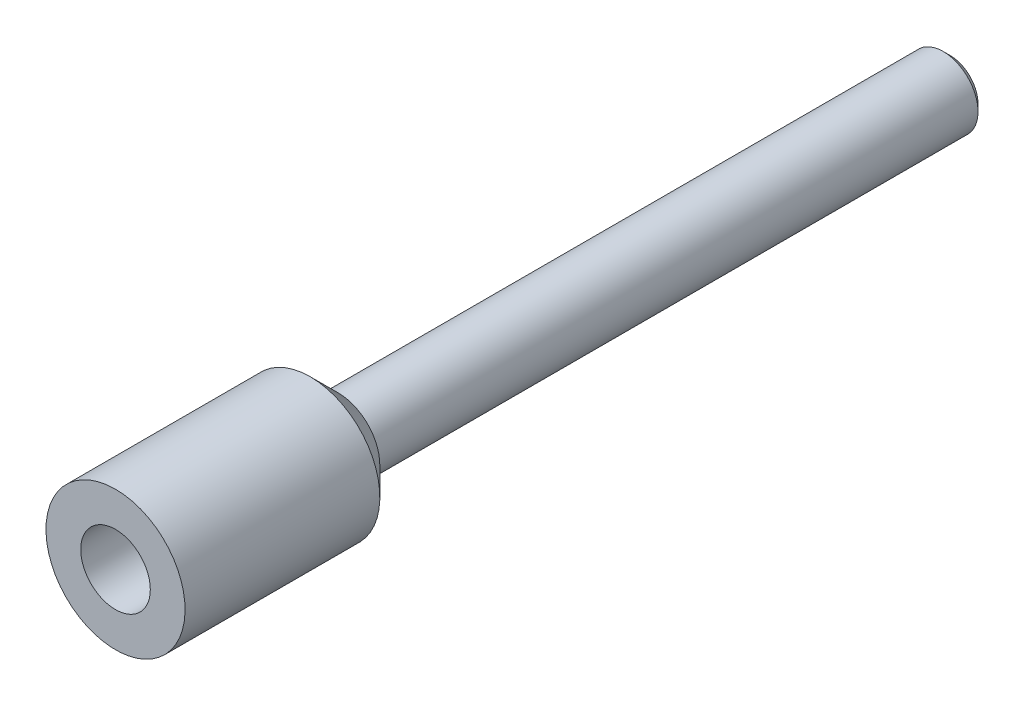
ISO-10303-21;
HEADER;
FILE_DESCRIPTION(('STEP AP214'),'2;1');
FILE_NAME('part.step','',(''),(''),'','','');
FILE_SCHEMA(('AUTOMOTIVE_DESIGN { 1 0 10303 214 1 1 1 1 }'));
ENDSEC;
DATA;
#1=APPLICATION_CONTEXT('core data for automotive mechanical design processes');
#2=APPLICATION_PROTOCOL_DEFINITION('international standard','automotive_design',2000,#1);
#3=PRODUCT_CONTEXT('',#1,'mechanical');
#4=PRODUCT('Part','Part','',(#3));
#5=PRODUCT_RELATED_PRODUCT_CATEGORY('part','',(#4));
#6=PRODUCT_DEFINITION_FORMATION('','',#4);
#7=PRODUCT_DEFINITION_CONTEXT('part definition',#1,'design');
#8=PRODUCT_DEFINITION('design','',#6,#7);
#9=PRODUCT_DEFINITION_SHAPE('','',#8);
#10=(LENGTH_UNIT() NAMED_UNIT(*) SI_UNIT(.MILLI.,.METRE.));
#11=(NAMED_UNIT(*) PLANE_ANGLE_UNIT() SI_UNIT($,.RADIAN.));
#12=(NAMED_UNIT(*) SI_UNIT($,.STERADIAN.) SOLID_ANGLE_UNIT());
#13=UNCERTAINTY_MEASURE_WITH_UNIT(LENGTH_MEASURE(1.E-05),#10,'distance_accuracy_value','');
#14=(GEOMETRIC_REPRESENTATION_CONTEXT(3) GLOBAL_UNCERTAINTY_ASSIGNED_CONTEXT((#13)) GLOBAL_UNIT_ASSIGNED_CONTEXT((#10,
#11,#12)) REPRESENTATION_CONTEXT('',''));
#15=CARTESIAN_POINT('',(0.,0.,0.));
#16=DIRECTION('',(0.,0.,1.));
#17=DIRECTION('',(1.,0.,0.));
#18=AXIS2_PLACEMENT_3D('',#15,#16,#17);
#19=CARTESIAN_POINT('',(0.,0.,0.));
#20=DIRECTION('',(0.,0.,1.));
#21=DIRECTION('',(0.,-1.,0.));
#22=AXIS2_PLACEMENT_3D('',#19,#20,#21);
#23=PLANE('',#22);
#24=CARTESIAN_POINT('',(0.,0.,0.));
#25=DIRECTION('',(0.,0.,1.));
#26=DIRECTION('',(1.,0.,0.));
#27=AXIS2_PLACEMENT_3D('',#24,#25,#26);
#28=CIRCLE('',#27,2.5);
#29=CARTESIAN_POINT('',(2.5,0.,0.));
#30=VERTEX_POINT('',#29);
#31=EDGE_CURVE('E86',#30,#30,#28,.T.);
#32=ORIENTED_EDGE('',*,*,#31,.F.);
#33=EDGE_LOOP('',(#32));
#34=FACE_BOUND('',#33,.T.);
#35=CARTESIAN_POINT('',(0.,0.,0.));
#36=DIRECTION('',(0.,0.,-1.));
#37=DIRECTION('',(0.,1.,0.));
#38=AXIS2_PLACEMENT_3D('',#35,#36,#37);
#39=CIRCLE('',#38,4.99999999999998);
#40=CARTESIAN_POINT('',(0.,4.99999999999998,0.));
#41=VERTEX_POINT('',#40);
#42=EDGE_CURVE('E99',#41,#41,#39,.T.);
#43=ORIENTED_EDGE('',*,*,#42,.F.);
#44=EDGE_LOOP('',(#43));
#45=FACE_BOUND('',#44,.T.);
#46=ADVANCED_FACE('F65',(#34,#45),#23,.T.);
#47=CARTESIAN_POINT('',(0.,0.,-60.));
#48=DIRECTION('',(0.,0.,-1.));
#49=DIRECTION('',(0.,1.,0.));
#50=AXIS2_PLACEMENT_3D('',#47,#48,#49);
#51=CYLINDRICAL_SURFACE('',#50,4.99999999999998);
#52=ORIENTED_EDGE('',*,*,#42,.T.);
#53=EDGE_LOOP('',(#52));
#54=FACE_BOUND('',#53,.T.);
#55=CARTESIAN_POINT('',(0.,0.,-14.));
#56=DIRECTION('',(0.,0.,-1.));
#57=DIRECTION('',(0.,1.,0.));
#58=AXIS2_PLACEMENT_3D('',#55,#56,#57);
#59=CIRCLE('',#58,4.99999999999998);
#60=CARTESIAN_POINT('',(0.,4.99999999999998,-14.));
#61=VERTEX_POINT('',#60);
#62=EDGE_CURVE('E96',#61,#61,#59,.T.);
#63=ORIENTED_EDGE('',*,*,#62,.F.);
#64=EDGE_LOOP('',(#63));
#65=FACE_BOUND('',#64,.T.);
#66=ADVANCED_FACE('F113',(#54,#65),#51,.T.);
#67=CARTESIAN_POINT('',(0.,0.,-16.));
#68=DIRECTION('',(0.,0.,1.));
#69=DIRECTION('',(0.,-1.,0.));
#70=AXIS2_PLACEMENT_3D('',#67,#68,#69);
#71=CONICAL_SURFACE('',#70,3.,0.785398163397443);
#72=ORIENTED_EDGE('',*,*,#62,.T.);
#73=EDGE_LOOP('',(#72));
#74=FACE_BOUND('',#73,.T.);
#75=CARTESIAN_POINT('',(0.,0.,-16.));
#76=DIRECTION('',(0.,0.,-1.));
#77=DIRECTION('',(0.,1.,0.));
#78=AXIS2_PLACEMENT_3D('',#75,#76,#77);
#79=CIRCLE('',#78,3.);
#80=CARTESIAN_POINT('',(0.,3.,-16.));
#81=VERTEX_POINT('',#80);
#82=EDGE_CURVE('E89',#81,#81,#79,.T.);
#83=ORIENTED_EDGE('',*,*,#82,.F.);
#84=EDGE_LOOP('',(#83));
#85=FACE_BOUND('',#84,.T.);
#86=ADVANCED_FACE('F118',(#74,#85),#71,.T.);
#87=CARTESIAN_POINT('',(0.,2.5,-16.));
#88=DIRECTION('',(0.,0.,-1.));
#89=DIRECTION('',(0.,1.,0.));
#90=AXIS2_PLACEMENT_3D('',#87,#88,#89);
#91=PLANE('',#90);
#92=ORIENTED_EDGE('',*,*,#82,.T.);
#93=EDGE_LOOP('',(#92));
#94=FACE_BOUND('',#93,.T.);
#95=CARTESIAN_POINT('',(0.,0.,-16.));
#96=DIRECTION('',(0.,0.,-1.));
#97=DIRECTION('',(0.,1.,0.));
#98=AXIS2_PLACEMENT_3D('',#95,#96,#97);
#99=CIRCLE('',#98,2.5);
#100=CARTESIAN_POINT('',(0.,2.5,-16.));
#101=VERTEX_POINT('',#100);
#102=EDGE_CURVE('E85',#101,#101,#99,.T.);
#103=ORIENTED_EDGE('',*,*,#102,.F.);
#104=EDGE_LOOP('',(#103));
#105=FACE_BOUND('',#104,.T.);
#106=ADVANCED_FACE('F126',(#94,#105),#91,.T.);
#107=CARTESIAN_POINT('',(0.,0.,-60.));
#108=DIRECTION('',(0.,0.,-1.));
#109=DIRECTION('',(0.,1.,0.));
#110=AXIS2_PLACEMENT_3D('',#107,#108,#109);
#111=CYLINDRICAL_SURFACE('',#110,2.5);
#112=CARTESIAN_POINT('',(0.,0.,-59.5));
#113=DIRECTION('',(0.,0.,-1.));
#114=DIRECTION('',(0.,1.,0.));
#115=AXIS2_PLACEMENT_3D('',#112,#113,#114);
#116=CIRCLE('',#115,2.5);
#117=CARTESIAN_POINT('',(0.,2.5,-59.5));
#118=VERTEX_POINT('',#117);
#119=EDGE_CURVE('E12',#118,#118,#116,.F.);
#120=ORIENTED_EDGE('',*,*,#119,.T.);
#121=EDGE_LOOP('',(#120));
#122=FACE_BOUND('',#121,.T.);
#123=ORIENTED_EDGE('',*,*,#102,.T.);
#124=EDGE_LOOP('',(#123));
#125=FACE_BOUND('',#124,.T.);
#126=ADVANCED_FACE('F130',(#122,#125),#111,.T.);
#127=CARTESIAN_POINT('',(0.,2.5,-60.));
#128=DIRECTION('',(0.,0.,-1.));
#129=DIRECTION('',(0.,1.,0.));
#130=AXIS2_PLACEMENT_3D('',#127,#128,#129);
#131=PLANE('',#130);
#132=CARTESIAN_POINT('',(0.,0.,-60.));
#133=DIRECTION('',(0.,0.,-1.));
#134=DIRECTION('',(0.,1.,0.));
#135=AXIS2_PLACEMENT_3D('',#132,#133,#134);
#136=CIRCLE('',#135,2.00000000000001);
#137=CARTESIAN_POINT('',(0.,2.00000000000001,-60.));
#138=VERTEX_POINT('',#137);
#139=EDGE_CURVE('E72',#138,#138,#136,.T.);
#140=ORIENTED_EDGE('',*,*,#139,.T.);
#141=EDGE_LOOP('',(#140));
#142=FACE_BOUND('',#141,.T.);
#143=ADVANCED_FACE('F79',(#142),#131,.T.);
#144=CARTESIAN_POINT('',(0.,0.,-12.));
#145=DIRECTION('',(0.,0.,1.));
#146=DIRECTION('',(1.,0.,0.));
#147=AXIS2_PLACEMENT_3D('',#144,#145,#146);
#148=CONICAL_SURFACE('',#147,2.5,1.02974425867665);
#149=CARTESIAN_POINT('',(0.,0.,-13.5021515475689));
#150=VERTEX_POINT('',#149);
#151=VERTEX_LOOP('',#150);
#152=FACE_BOUND('',#151,.T.);
#153=CARTESIAN_POINT('',(0.,0.,-12.));
#154=DIRECTION('',(0.,0.,1.));
#155=DIRECTION('',(1.,0.,0.));
#156=AXIS2_PLACEMENT_3D('',#153,#154,#155);
#157=CIRCLE('',#156,2.5);
#158=CARTESIAN_POINT('',(2.5,0.,-12.));
#159=VERTEX_POINT('',#158);
#160=EDGE_CURVE('E83',#159,#159,#157,.T.);
#161=ORIENTED_EDGE('',*,*,#160,.T.);
#162=EDGE_LOOP('',(#161));
#163=FACE_BOUND('',#162,.T.);
#164=ADVANCED_FACE('F75',(#152,#163),#148,.F.);
#165=CARTESIAN_POINT('',(0.,0.,0.));
#166=DIRECTION('',(0.,0.,1.));
#167=DIRECTION('',(1.,0.,0.));
#168=AXIS2_PLACEMENT_3D('',#165,#166,#167);
#169=CYLINDRICAL_SURFACE('',#168,2.5);
#170=ORIENTED_EDGE('',*,*,#160,.F.);
#171=EDGE_LOOP('',(#170));
#172=FACE_BOUND('',#171,.T.);
#173=ORIENTED_EDGE('',*,*,#31,.T.);
#174=EDGE_LOOP('',(#173));
#175=FACE_BOUND('',#174,.T.);
#176=ADVANCED_FACE('F78',(#172,#175),#169,.F.);
#177=CARTESIAN_POINT('',(0.,0.,-60.));
#178=DIRECTION('',(0.,0.,1.));
#179=DIRECTION('',(0.,-1.,0.));
#180=AXIS2_PLACEMENT_3D('',#177,#178,#179);
#181=CONICAL_SURFACE('',#180,2.00000000000001,0.785398163397447);
#182=ORIENTED_EDGE('',*,*,#119,.F.);
#183=EDGE_LOOP('',(#182));
#184=FACE_BOUND('',#183,.T.);
#185=ORIENTED_EDGE('',*,*,#139,.F.);
#186=EDGE_LOOP('',(#185));
#187=FACE_BOUND('',#186,.T.);
#188=ADVANCED_FACE('F67',(#184,#187),#181,.T.);
#189=CLOSED_SHELL('',(#46,#66,#86,#106,#126,#143,#164,#176,#188));
#190=MANIFOLD_SOLID_BREP('B2',#189);
#191=ADVANCED_BREP_SHAPE_REPRESENTATION('',(#18,#190),#14);
#192=SHAPE_DEFINITION_REPRESENTATION(#9,#191);
ENDSEC;
END-ISO-10303-21;
